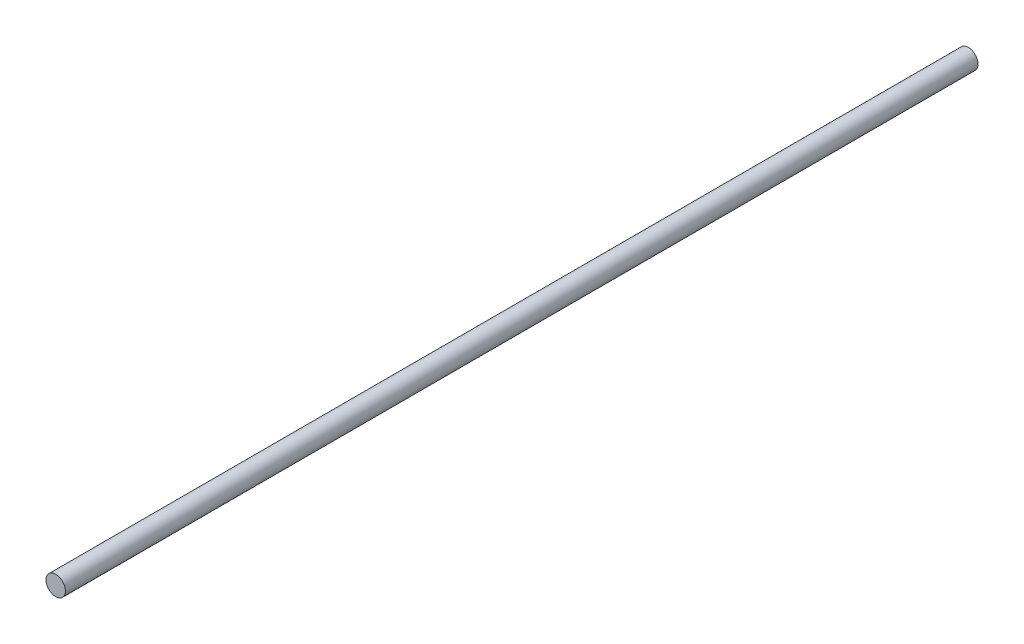
ISO-10303-21;
HEADER;
FILE_DESCRIPTION(('STEP AP214'),'2;1');
FILE_NAME('part.step','',(''),(''),'','','');
FILE_SCHEMA(('AUTOMOTIVE_DESIGN { 1 0 10303 214 1 1 1 1 }'));
ENDSEC;
DATA;
#1=APPLICATION_CONTEXT('core data for automotive mechanical design processes');
#2=APPLICATION_PROTOCOL_DEFINITION('international standard','automotive_design',2000,#1);
#3=PRODUCT_CONTEXT('',#1,'mechanical');
#4=PRODUCT('Part','Part','',(#3));
#5=PRODUCT_RELATED_PRODUCT_CATEGORY('part','',(#4));
#6=PRODUCT_DEFINITION_FORMATION('','',#4);
#7=PRODUCT_DEFINITION_CONTEXT('part definition',#1,'design');
#8=PRODUCT_DEFINITION('design','',#6,#7);
#9=PRODUCT_DEFINITION_SHAPE('','',#8);
#10=(LENGTH_UNIT() NAMED_UNIT(*) SI_UNIT(.MILLI.,.METRE.));
#11=(NAMED_UNIT(*) PLANE_ANGLE_UNIT() SI_UNIT($,.RADIAN.));
#12=(NAMED_UNIT(*) SI_UNIT($,.STERADIAN.) SOLID_ANGLE_UNIT());
#13=UNCERTAINTY_MEASURE_WITH_UNIT(LENGTH_MEASURE(1.E-05),#10,'distance_accuracy_value','');
#14=(GEOMETRIC_REPRESENTATION_CONTEXT(3) GLOBAL_UNCERTAINTY_ASSIGNED_CONTEXT((#13)) GLOBAL_UNIT_ASSIGNED_CONTEXT((#10,
#11,#12)) REPRESENTATION_CONTEXT('',''));
#15=CARTESIAN_POINT('',(0.,0.,0.));
#16=DIRECTION('',(0.,0.,1.));
#17=DIRECTION('',(1.,0.,0.));
#18=AXIS2_PLACEMENT_3D('',#15,#16,#17);
#19=CARTESIAN_POINT('',(0.,0.,940.));
#20=DIRECTION('',(0.,0.,-1.));
#21=DIRECTION('',(-1.,0.,0.));
#22=AXIS2_PLACEMENT_3D('',#19,#20,#21);
#23=CYLINDRICAL_SURFACE('',#22,10.);
#24=CARTESIAN_POINT('',(0.,0.,940.));
#25=DIRECTION('',(0.,0.,1.));
#26=DIRECTION('',(1.,0.,0.));
#27=AXIS2_PLACEMENT_3D('',#24,#25,#26);
#28=CIRCLE('',#27,10.);
#29=CARTESIAN_POINT('',(-10.,0.,940.));
#30=VERTEX_POINT('',#29);
#31=EDGE_CURVE('E10',#30,#30,#28,.T.);
#32=CARTESIAN_POINT('',(0.,0.,0.));
#33=DIRECTION('',(0.,0.,1.));
#34=DIRECTION('',(1.,0.,0.));
#35=AXIS2_PLACEMENT_3D('',#32,#33,#34);
#36=CIRCLE('',#35,10.);
#37=CARTESIAN_POINT('',(-10.,0.,-1.11022302462516E-13));
#38=VERTEX_POINT('',#37);
#39=EDGE_CURVE('E40',#38,#38,#36,.T.);
#40=CARTESIAN_POINT('',(-10.,0.,940.));
#41=CARTESIAN_POINT('',(-10.,0.,930.208333333333));
#42=CARTESIAN_POINT('',(-10.,0.,920.416666666667));
#43=CARTESIAN_POINT('',(-10.,0.,900.833333333333));
#44=CARTESIAN_POINT('',(-10.,0.,891.041666666667));
#45=CARTESIAN_POINT('',(-10.,0.,871.458333333333));
#46=CARTESIAN_POINT('',(-10.,0.,861.666666666667));
#47=CARTESIAN_POINT('',(-10.,0.,842.083333333333));
#48=CARTESIAN_POINT('',(-10.,0.,832.291666666667));
#49=CARTESIAN_POINT('',(-10.,0.,812.708333333333));
#50=CARTESIAN_POINT('',(-10.,0.,802.916666666667));
#51=CARTESIAN_POINT('',(-10.,0.,783.333333333333));
#52=CARTESIAN_POINT('',(-10.,0.,773.541666666667));
#53=CARTESIAN_POINT('',(-10.,0.,753.958333333333));
#54=CARTESIAN_POINT('',(-10.,0.,744.166666666667));
#55=CARTESIAN_POINT('',(-10.,0.,724.583333333333));
#56=CARTESIAN_POINT('',(-10.,0.,714.791666666667));
#57=CARTESIAN_POINT('',(-10.,0.,695.208333333333));
#58=CARTESIAN_POINT('',(-10.,0.,685.416666666667));
#59=CARTESIAN_POINT('',(-10.,0.,665.833333333333));
#60=CARTESIAN_POINT('',(-10.,0.,656.041666666667));
#61=CARTESIAN_POINT('',(-10.,0.,636.458333333333));
#62=CARTESIAN_POINT('',(-10.,0.,626.666666666667));
#63=CARTESIAN_POINT('',(-10.,0.,607.083333333333));
#64=CARTESIAN_POINT('',(-10.,0.,597.291666666667));
#65=CARTESIAN_POINT('',(-10.,0.,577.708333333333));
#66=CARTESIAN_POINT('',(-10.,0.,567.916666666667));
#67=CARTESIAN_POINT('',(-10.,0.,548.333333333333));
#68=CARTESIAN_POINT('',(-10.,0.,538.541666666667));
#69=CARTESIAN_POINT('',(-10.,0.,518.958333333333));
#70=CARTESIAN_POINT('',(-10.,0.,509.166666666667));
#71=CARTESIAN_POINT('',(-10.,0.,489.583333333333));
#72=CARTESIAN_POINT('',(-10.,0.,479.791666666667));
#73=CARTESIAN_POINT('',(-10.,0.,460.208333333333));
#74=CARTESIAN_POINT('',(-10.,0.,450.416666666667));
#75=CARTESIAN_POINT('',(-10.,0.,430.833333333333));
#76=CARTESIAN_POINT('',(-10.,0.,421.041666666667));
#77=CARTESIAN_POINT('',(-10.,0.,401.458333333333));
#78=CARTESIAN_POINT('',(-10.,0.,391.666666666667));
#79=CARTESIAN_POINT('',(-10.,0.,372.083333333333));
#80=CARTESIAN_POINT('',(-10.,0.,362.291666666667));
#81=CARTESIAN_POINT('',(-10.,0.,342.708333333333));
#82=CARTESIAN_POINT('',(-10.,0.,332.916666666667));
#83=CARTESIAN_POINT('',(-10.,0.,313.333333333333));
#84=CARTESIAN_POINT('',(-10.,0.,303.541666666667));
#85=CARTESIAN_POINT('',(-10.,0.,283.958333333333));
#86=CARTESIAN_POINT('',(-10.,0.,274.166666666667));
#87=CARTESIAN_POINT('',(-10.,0.,254.583333333333));
#88=CARTESIAN_POINT('',(-10.,0.,244.791666666667));
#89=CARTESIAN_POINT('',(-10.,0.,225.208333333333));
#90=CARTESIAN_POINT('',(-10.,0.,215.416666666667));
#91=CARTESIAN_POINT('',(-10.,0.,195.833333333333));
#92=CARTESIAN_POINT('',(-10.,0.,186.041666666667));
#93=CARTESIAN_POINT('',(-10.,0.,166.458333333333));
#94=CARTESIAN_POINT('',(-10.,0.,156.666666666667));
#95=CARTESIAN_POINT('',(-10.,0.,137.083333333333));
#96=CARTESIAN_POINT('',(-10.,0.,127.291666666667));
#97=CARTESIAN_POINT('',(-10.,0.,107.708333333333));
#98=CARTESIAN_POINT('',(-10.,0.,97.9166666666666));
#99=CARTESIAN_POINT('',(-10.,0.,78.3333333333332));
#100=CARTESIAN_POINT('',(-10.,0.,68.5416666666665));
#101=CARTESIAN_POINT('',(-10.,0.,48.9583333333332));
#102=CARTESIAN_POINT('',(-10.,0.,39.1666666666666));
#103=CARTESIAN_POINT('',(-10.,0.,19.5833333333332));
#104=CARTESIAN_POINT('',(-10.,0.,9.79166666666656));
#105=CARTESIAN_POINT('',(-10.,0.,-1.11022302462516E-13));
#106=B_SPLINE_CURVE_WITH_KNOTS('',3,(#40,#41,#42,#43,#44,#45,#46,#47,#48,#49,#50,#51,#52,#53,
#54,#55,#56,#57,#58,#59,#60,#61,#62,#63,#64,#65,#66,#67,#68,#69,#70,#71,#72,#73,#74,#75,#76,#77,
#78,#79,#80,#81,#82,#83,#84,#85,#86,#87,#88,#89,#90,#91,#92,#93,#94,#95,#96,#97,#98,#99,#100,
#101,#102,#103,#104,#105),.UNSPECIFIED.,.F.,.F.,(4,2,2,2,2,2,2,2,2,2,2,2,2,2,2,2,2,2,2,2,2,2,2,
2,2,2,2,2,2,2,2,2,4),(0.,29.375,58.7500000000001,88.125,117.5,146.875,176.25,205.625,235.,
264.375,293.75,323.125,352.5,381.875,411.25,440.625,470.,499.375,528.75,558.125,587.5,616.875,
646.25,675.625,705.,734.375,763.75,793.125,822.5,851.875,881.25,910.625,940.),.UNSPECIFIED.);
#107=EDGE_CURVE('BSEAM37',#30,#38,#106,.T.);
#108=ORIENTED_EDGE('',*,*,#31,.F.);
#109=ORIENTED_EDGE('',*,*,#39,.T.);
#110=ORIENTED_EDGE('',*,*,#107,.T.);
#111=ORIENTED_EDGE('',*,*,#107,.F.);
#112=EDGE_LOOP('',(#108,#110,#109,#111));
#113=FACE_BOUND('',#112,.T.);
#114=ADVANCED_FACE('F37',(#113),#23,.T.);
#115=CARTESIAN_POINT('',(0.,0.,940.));
#116=DIRECTION('',(0.,0.,1.));
#117=DIRECTION('',(1.,0.,0.));
#118=AXIS2_PLACEMENT_3D('',#115,#116,#117);
#119=PLANE('',#118);
#120=ORIENTED_EDGE('',*,*,#31,.T.);
#121=EDGE_LOOP('',(#120));
#122=FACE_BOUND('',#121,.T.);
#123=ADVANCED_FACE('F54',(#122),#119,.T.);
#124=CARTESIAN_POINT('',(0.,0.,0.));
#125=DIRECTION('',(0.,0.,1.));
#126=DIRECTION('',(1.,0.,0.));
#127=AXIS2_PLACEMENT_3D('',#124,#125,#126);
#128=PLANE('',#127);
#129=ORIENTED_EDGE('',*,*,#39,.F.);
#130=EDGE_LOOP('',(#129));
#131=FACE_BOUND('',#130,.T.);
#132=ADVANCED_FACE('F52',(#131),#128,.F.);
#133=CLOSED_SHELL('',(#114,#123,#132));
#134=MANIFOLD_SOLID_BREP('B2',#133);
#135=ADVANCED_BREP_SHAPE_REPRESENTATION('',(#18,#134),#14);
#136=SHAPE_DEFINITION_REPRESENTATION(#9,#135);
ENDSEC;
END-ISO-10303-21;
